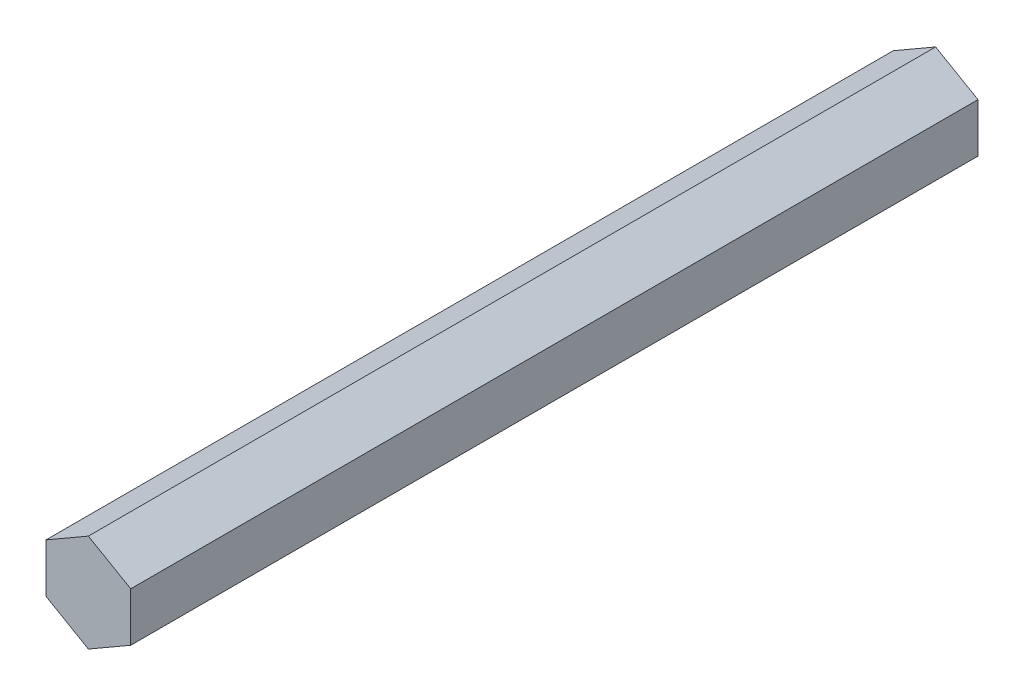
ISO-10303-21;
HEADER;
FILE_DESCRIPTION(('STEP AP214'),'2;1');
FILE_NAME('part.step','',(''),(''),'','','');
FILE_SCHEMA(('AUTOMOTIVE_DESIGN { 1 0 10303 214 1 1 1 1 }'));
ENDSEC;
DATA;
#1=APPLICATION_CONTEXT('core data for automotive mechanical design processes');
#2=APPLICATION_PROTOCOL_DEFINITION('international standard','automotive_design',2000,#1);
#3=PRODUCT_CONTEXT('',#1,'mechanical');
#4=PRODUCT('Part','Part','',(#3));
#5=PRODUCT_RELATED_PRODUCT_CATEGORY('part','',(#4));
#6=PRODUCT_DEFINITION_FORMATION('','',#4);
#7=PRODUCT_DEFINITION_CONTEXT('part definition',#1,'design');
#8=PRODUCT_DEFINITION('design','',#6,#7);
#9=PRODUCT_DEFINITION_SHAPE('','',#8);
#10=(LENGTH_UNIT() NAMED_UNIT(*) SI_UNIT(.MILLI.,.METRE.));
#11=(NAMED_UNIT(*) PLANE_ANGLE_UNIT() SI_UNIT($,.RADIAN.));
#12=(NAMED_UNIT(*) SI_UNIT($,.STERADIAN.) SOLID_ANGLE_UNIT());
#13=UNCERTAINTY_MEASURE_WITH_UNIT(LENGTH_MEASURE(1.E-05),#10,'distance_accuracy_value','');
#14=(GEOMETRIC_REPRESENTATION_CONTEXT(3) GLOBAL_UNCERTAINTY_ASSIGNED_CONTEXT((#13)) GLOBAL_UNIT_ASSIGNED_CONTEXT((#10,
#11,#12)) REPRESENTATION_CONTEXT('',''));
#15=CARTESIAN_POINT('',(0.,0.,0.));
#16=DIRECTION('',(0.,0.,1.));
#17=DIRECTION('',(1.,0.,0.));
#18=AXIS2_PLACEMENT_3D('',#15,#16,#17);
#19=CARTESIAN_POINT('',(-6.35,-3.66617420935413,127.));
#20=DIRECTION('',(0.5,0.866025403784439,0.));
#21=DIRECTION('',(-0.866025403784439,0.5,0.));
#22=AXIS2_PLACEMENT_3D('',#19,#20,#21);
#23=PLANE('',#22);
#24=DIRECTION('',(0.866025403784439,-0.5,0.));
#25=VECTOR('',#24,1.);
#26=CARTESIAN_POINT('',(-6.35,-3.66617420935413,0.));
#27=LINE('',#26,#25);
#28=CARTESIAN_POINT('',(-6.35,-3.66617420935413,0.));
#29=VERTEX_POINT('',#28);
#30=CARTESIAN_POINT('',(0.,-7.33234841870825,0.));
#31=VERTEX_POINT('',#30);
#32=EDGE_CURVE('E117',#29,#31,#27,.T.);
#33=ORIENTED_EDGE('',*,*,#32,.T.);
#34=DIRECTION('',(0.,0.,-1.));
#35=VECTOR('',#34,1.);
#36=CARTESIAN_POINT('',(0.,-7.33234841870825,127.));
#37=LINE('',#36,#35);
#38=CARTESIAN_POINT('',(0.,-7.33234841870825,127.));
#39=VERTEX_POINT('',#38);
#40=EDGE_CURVE('E11',#39,#31,#37,.T.);
#41=ORIENTED_EDGE('',*,*,#40,.F.);
#42=DIRECTION('',(0.866025403784439,-0.5,0.));
#43=VECTOR('',#42,1.);
#44=CARTESIAN_POINT('',(-6.35,-3.66617420935413,127.));
#45=LINE('',#44,#43);
#46=CARTESIAN_POINT('',(-6.35,-3.66617420935413,127.));
#47=VERTEX_POINT('',#46);
#48=EDGE_CURVE('E127',#47,#39,#45,.T.);
#49=ORIENTED_EDGE('',*,*,#48,.F.);
#50=DIRECTION('',(0.,0.,-1.));
#51=VECTOR('',#50,1.);
#52=CARTESIAN_POINT('',(-6.35,-3.66617420935413,127.));
#53=LINE('',#52,#51);
#54=EDGE_CURVE('E113',#47,#29,#53,.T.);
#55=ORIENTED_EDGE('',*,*,#54,.T.);
#56=EDGE_LOOP('',(#33,#41,#49,#55));
#57=FACE_BOUND('',#56,.T.);
#58=ADVANCED_FACE('F33',(#57),#23,.F.);
#59=CARTESIAN_POINT('',(0.,-7.33234841870825,127.));
#60=DIRECTION('',(-0.500000000000001,0.866025403784438,0.));
#61=DIRECTION('',(-0.866025403784438,-0.500000000000001,0.));
#62=AXIS2_PLACEMENT_3D('',#59,#60,#61);
#63=PLANE('',#62);
#64=DIRECTION('',(0.866025403784438,0.500000000000001,0.));
#65=VECTOR('',#64,1.);
#66=CARTESIAN_POINT('',(0.,-7.33234841870825,0.));
#67=LINE('',#66,#65);
#68=CARTESIAN_POINT('',(6.35,-3.66617420935412,0.));
#69=VERTEX_POINT('',#68);
#70=EDGE_CURVE('E120',#31,#69,#67,.T.);
#71=ORIENTED_EDGE('',*,*,#70,.T.);
#72=DIRECTION('',(0.,0.,-1.));
#73=VECTOR('',#72,1.);
#74=CARTESIAN_POINT('',(6.35,-3.66617420935412,127.));
#75=LINE('',#74,#73);
#76=CARTESIAN_POINT('',(6.35,-3.66617420935412,127.));
#77=VERTEX_POINT('',#76);
#78=EDGE_CURVE('E41',#77,#69,#75,.T.);
#79=ORIENTED_EDGE('',*,*,#78,.F.);
#80=DIRECTION('',(0.866025403784438,0.500000000000001,0.));
#81=VECTOR('',#80,1.);
#82=CARTESIAN_POINT('',(0.,-7.33234841870825,127.));
#83=LINE('',#82,#81);
#84=EDGE_CURVE('E86',#39,#77,#83,.T.);
#85=ORIENTED_EDGE('',*,*,#84,.F.);
#86=ORIENTED_EDGE('',*,*,#40,.T.);
#87=EDGE_LOOP('',(#71,#79,#85,#86));
#88=FACE_BOUND('',#87,.T.);
#89=ADVANCED_FACE('F151',(#88),#63,.F.);
#90=CARTESIAN_POINT('',(6.35,-3.66617420935412,127.));
#91=DIRECTION('',(-1.,0.,0.));
#92=DIRECTION('',(0.,-1.,0.));
#93=AXIS2_PLACEMENT_3D('',#90,#91,#92);
#94=PLANE('',#93);
#95=DIRECTION('',(0.,1.,0.));
#96=VECTOR('',#95,1.);
#97=CARTESIAN_POINT('',(6.35,-3.66617420935412,0.));
#98=LINE('',#97,#96);
#99=CARTESIAN_POINT('',(6.35,3.66617420935412,0.));
#100=VERTEX_POINT('',#99);
#101=EDGE_CURVE('E122',#69,#100,#98,.T.);
#102=ORIENTED_EDGE('',*,*,#101,.T.);
#103=DIRECTION('',(0.,0.,-1.));
#104=VECTOR('',#103,1.);
#105=CARTESIAN_POINT('',(6.35,3.66617420935412,127.));
#106=LINE('',#105,#104);
#107=CARTESIAN_POINT('',(6.35,3.66617420935412,127.));
#108=VERTEX_POINT('',#107);
#109=EDGE_CURVE('E108',#108,#100,#106,.T.);
#110=ORIENTED_EDGE('',*,*,#109,.F.);
#111=DIRECTION('',(0.,1.,0.));
#112=VECTOR('',#111,1.);
#113=CARTESIAN_POINT('',(6.35,-3.66617420935412,127.));
#114=LINE('',#113,#112);
#115=EDGE_CURVE('E99',#77,#108,#114,.T.);
#116=ORIENTED_EDGE('',*,*,#115,.F.);
#117=ORIENTED_EDGE('',*,*,#78,.T.);
#118=EDGE_LOOP('',(#102,#110,#116,#117));
#119=FACE_BOUND('',#118,.T.);
#120=ADVANCED_FACE('F133',(#119),#94,.F.);
#121=CARTESIAN_POINT('',(6.35,3.66617420935412,127.));
#122=DIRECTION('',(-0.5,-0.866025403784439,0.));
#123=DIRECTION('',(0.866025403784439,-0.5,0.));
#124=AXIS2_PLACEMENT_3D('',#121,#122,#123);
#125=PLANE('',#124);
#126=DIRECTION('',(-0.866025403784439,0.5,0.));
#127=VECTOR('',#126,1.);
#128=CARTESIAN_POINT('',(6.35,3.66617420935412,0.));
#129=LINE('',#128,#127);
#130=CARTESIAN_POINT('',(0.,7.33234841870825,0.));
#131=VERTEX_POINT('',#130);
#132=EDGE_CURVE('E107',#100,#131,#129,.T.);
#133=ORIENTED_EDGE('',*,*,#132,.T.);
#134=DIRECTION('',(0.,0.,-1.));
#135=VECTOR('',#134,1.);
#136=CARTESIAN_POINT('',(0.,7.33234841870825,127.));
#137=LINE('',#136,#135);
#138=CARTESIAN_POINT('',(0.,7.33234841870825,127.));
#139=VERTEX_POINT('',#138);
#140=EDGE_CURVE('E104',#139,#131,#137,.T.);
#141=ORIENTED_EDGE('',*,*,#140,.F.);
#142=DIRECTION('',(-0.866025403784439,0.5,0.));
#143=VECTOR('',#142,1.);
#144=CARTESIAN_POINT('',(6.35,3.66617420935412,127.));
#145=LINE('',#144,#143);
#146=EDGE_CURVE('E93',#108,#139,#145,.T.);
#147=ORIENTED_EDGE('',*,*,#146,.F.);
#148=ORIENTED_EDGE('',*,*,#109,.T.);
#149=EDGE_LOOP('',(#133,#141,#147,#148));
#150=FACE_BOUND('',#149,.T.);
#151=ADVANCED_FACE('F105',(#150),#125,.F.);
#152=CARTESIAN_POINT('',(0.,7.33234841870825,127.));
#153=DIRECTION('',(0.5,-0.866025403784438,0.));
#154=DIRECTION('',(0.866025403784438,0.500000000000001,0.));
#155=AXIS2_PLACEMENT_3D('',#152,#153,#154);
#156=PLANE('',#155);
#157=DIRECTION('',(-0.866025403784438,-0.500000000000001,0.));
#158=VECTOR('',#157,1.);
#159=CARTESIAN_POINT('',(0.,7.33234841870825,0.));
#160=LINE('',#159,#158);
#161=CARTESIAN_POINT('',(-6.35,3.66617420935412,0.));
#162=VERTEX_POINT('',#161);
#163=EDGE_CURVE('E72',#131,#162,#160,.T.);
#164=ORIENTED_EDGE('',*,*,#163,.T.);
#165=DIRECTION('',(0.,0.,-1.));
#166=VECTOR('',#165,1.);
#167=CARTESIAN_POINT('',(-6.35,3.66617420935412,127.));
#168=LINE('',#167,#166);
#169=CARTESIAN_POINT('',(-6.35,3.66617420935412,127.));
#170=VERTEX_POINT('',#169);
#171=EDGE_CURVE('E109',#170,#162,#168,.T.);
#172=ORIENTED_EDGE('',*,*,#171,.F.);
#173=DIRECTION('',(-0.866025403784438,-0.500000000000001,0.));
#174=VECTOR('',#173,1.);
#175=CARTESIAN_POINT('',(0.,7.33234841870825,127.));
#176=LINE('',#175,#174);
#177=EDGE_CURVE('E97',#139,#170,#176,.T.);
#178=ORIENTED_EDGE('',*,*,#177,.F.);
#179=ORIENTED_EDGE('',*,*,#140,.T.);
#180=EDGE_LOOP('',(#164,#172,#178,#179));
#181=FACE_BOUND('',#180,.T.);
#182=ADVANCED_FACE('F111',(#181),#156,.F.);
#183=CARTESIAN_POINT('',(-6.35,3.66617420935412,127.));
#184=DIRECTION('',(1.,0.,0.));
#185=DIRECTION('',(0.,1.,0.));
#186=AXIS2_PLACEMENT_3D('',#183,#184,#185);
#187=PLANE('',#186);
#188=DIRECTION('',(0.,-1.,0.));
#189=VECTOR('',#188,1.);
#190=CARTESIAN_POINT('',(-6.35,3.66617420935412,0.));
#191=LINE('',#190,#189);
#192=EDGE_CURVE('E78',#162,#29,#191,.T.);
#193=ORIENTED_EDGE('',*,*,#192,.T.);
#194=ORIENTED_EDGE('',*,*,#54,.F.);
#195=DIRECTION('',(0.,-1.,0.));
#196=VECTOR('',#195,1.);
#197=CARTESIAN_POINT('',(-6.35,3.66617420935412,127.));
#198=LINE('',#197,#196);
#199=EDGE_CURVE('E49',#170,#47,#198,.T.);
#200=ORIENTED_EDGE('',*,*,#199,.F.);
#201=ORIENTED_EDGE('',*,*,#171,.T.);
#202=EDGE_LOOP('',(#193,#194,#200,#201));
#203=FACE_BOUND('',#202,.T.);
#204=ADVANCED_FACE('F140',(#203),#187,.F.);
#205=CARTESIAN_POINT('',(0.,0.,127.));
#206=DIRECTION('',(0.,0.,1.));
#207=DIRECTION('',(1.,0.,0.));
#208=AXIS2_PLACEMENT_3D('',#205,#206,#207);
#209=PLANE('',#208);
#210=ORIENTED_EDGE('',*,*,#48,.T.);
#211=ORIENTED_EDGE('',*,*,#84,.T.);
#212=ORIENTED_EDGE('',*,*,#115,.T.);
#213=ORIENTED_EDGE('',*,*,#146,.T.);
#214=ORIENTED_EDGE('',*,*,#177,.T.);
#215=ORIENTED_EDGE('',*,*,#199,.T.);
#216=EDGE_LOOP('',(#210,#211,#212,#213,#214,#215));
#217=FACE_BOUND('',#216,.T.);
#218=ADVANCED_FACE('F95',(#217),#209,.T.);
#219=CARTESIAN_POINT('',(0.,0.,0.));
#220=DIRECTION('',(0.,0.,1.));
#221=DIRECTION('',(1.,0.,0.));
#222=AXIS2_PLACEMENT_3D('',#219,#220,#221);
#223=PLANE('',#222);
#224=ORIENTED_EDGE('',*,*,#32,.F.);
#225=ORIENTED_EDGE('',*,*,#192,.F.);
#226=ORIENTED_EDGE('',*,*,#163,.F.);
#227=ORIENTED_EDGE('',*,*,#132,.F.);
#228=ORIENTED_EDGE('',*,*,#101,.F.);
#229=ORIENTED_EDGE('',*,*,#70,.F.);
#230=EDGE_LOOP('',(#224,#225,#226,#227,#228,#229));
#231=FACE_BOUND('',#230,.T.);
#232=ADVANCED_FACE('F136',(#231),#223,.F.);
#233=CLOSED_SHELL('',(#58,#89,#120,#151,#182,#204,#218,#232));
#234=MANIFOLD_SOLID_BREP('B2',#233);
#235=ADVANCED_BREP_SHAPE_REPRESENTATION('',(#18,#234),#14);
#236=SHAPE_DEFINITION_REPRESENTATION(#9,#235);
ENDSEC;
END-ISO-10303-21;
